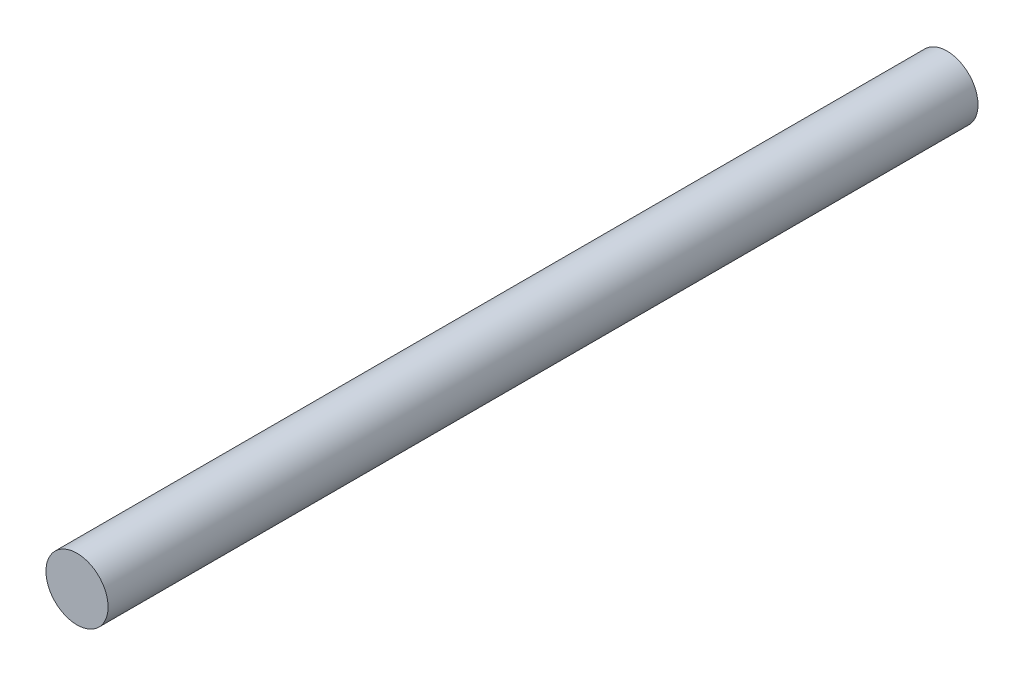
ISO-10303-21;
HEADER;
FILE_DESCRIPTION(('STEP AP214'),'2;1');
FILE_NAME('part.step','',(''),(''),'','','');
FILE_SCHEMA(('AUTOMOTIVE_DESIGN { 1 0 10303 214 1 1 1 1 }'));
ENDSEC;
DATA;
#1=APPLICATION_CONTEXT('core data for automotive mechanical design processes');
#2=APPLICATION_PROTOCOL_DEFINITION('international standard','automotive_design',2000,#1);
#3=PRODUCT_CONTEXT('',#1,'mechanical');
#4=PRODUCT('Part','Part','',(#3));
#5=PRODUCT_RELATED_PRODUCT_CATEGORY('part','',(#4));
#6=PRODUCT_DEFINITION_FORMATION('','',#4);
#7=PRODUCT_DEFINITION_CONTEXT('part definition',#1,'design');
#8=PRODUCT_DEFINITION('design','',#6,#7);
#9=PRODUCT_DEFINITION_SHAPE('','',#8);
#10=(LENGTH_UNIT() NAMED_UNIT(*) SI_UNIT(.MILLI.,.METRE.));
#11=(NAMED_UNIT(*) PLANE_ANGLE_UNIT() SI_UNIT($,.RADIAN.));
#12=(NAMED_UNIT(*) SI_UNIT($,.STERADIAN.) SOLID_ANGLE_UNIT());
#13=UNCERTAINTY_MEASURE_WITH_UNIT(LENGTH_MEASURE(1.E-05),#10,'distance_accuracy_value','');
#14=(GEOMETRIC_REPRESENTATION_CONTEXT(3) GLOBAL_UNCERTAINTY_ASSIGNED_CONTEXT((#13)) GLOBAL_UNIT_ASSIGNED_CONTEXT((#10,
#11,#12)) REPRESENTATION_CONTEXT('',''));
#15=CARTESIAN_POINT('',(0.,0.,0.));
#16=DIRECTION('',(0.,0.,1.));
#17=DIRECTION('',(1.,0.,0.));
#18=AXIS2_PLACEMENT_3D('',#15,#16,#17);
#19=CARTESIAN_POINT('',(0.,0.,70.));
#20=DIRECTION('',(0.,0.,-1.));
#21=DIRECTION('',(-1.,0.,0.));
#22=AXIS2_PLACEMENT_3D('',#19,#20,#21);
#23=CYLINDRICAL_SURFACE('',#22,5.);
#24=CARTESIAN_POINT('',(0.,0.,70.));
#25=DIRECTION('',(0.,0.,1.));
#26=DIRECTION('',(1.,0.,0.));
#27=AXIS2_PLACEMENT_3D('',#24,#25,#26);
#28=CIRCLE('',#27,5.);
#29=CARTESIAN_POINT('',(5.,0.,70.));
#30=VERTEX_POINT('',#29);
#31=EDGE_CURVE('E10',#30,#30,#28,.T.);
#32=ORIENTED_EDGE('',*,*,#31,.F.);
#33=EDGE_LOOP('',(#32));
#34=FACE_BOUND('',#33,.T.);
#35=CARTESIAN_POINT('',(0.,0.,-70.));
#36=DIRECTION('',(0.,0.,1.));
#37=DIRECTION('',(1.,0.,0.));
#38=AXIS2_PLACEMENT_3D('',#35,#36,#37);
#39=CIRCLE('',#38,5.);
#40=CARTESIAN_POINT('',(5.,0.,-70.));
#41=VERTEX_POINT('',#40);
#42=EDGE_CURVE('E36',#41,#41,#39,.T.);
#43=ORIENTED_EDGE('',*,*,#42,.T.);
#44=EDGE_LOOP('',(#43));
#45=FACE_BOUND('',#44,.T.);
#46=ADVANCED_FACE('F33',(#34,#45),#23,.T.);
#47=CARTESIAN_POINT('',(0.,0.,70.));
#48=DIRECTION('',(0.,0.,1.));
#49=DIRECTION('',(1.,0.,0.));
#50=AXIS2_PLACEMENT_3D('',#47,#48,#49);
#51=PLANE('',#50);
#52=ORIENTED_EDGE('',*,*,#31,.T.);
#53=EDGE_LOOP('',(#52));
#54=FACE_BOUND('',#53,.T.);
#55=ADVANCED_FACE('F48',(#54),#51,.T.);
#56=CARTESIAN_POINT('',(0.,0.,-70.));
#57=DIRECTION('',(0.,0.,1.));
#58=DIRECTION('',(1.,0.,0.));
#59=AXIS2_PLACEMENT_3D('',#56,#57,#58);
#60=PLANE('',#59);
#61=ORIENTED_EDGE('',*,*,#42,.F.);
#62=EDGE_LOOP('',(#61));
#63=FACE_BOUND('',#62,.T.);
#64=ADVANCED_FACE('F46',(#63),#60,.F.);
#65=CLOSED_SHELL('',(#46,#55,#64));
#66=MANIFOLD_SOLID_BREP('B2',#65);
#67=ADVANCED_BREP_SHAPE_REPRESENTATION('',(#18,#66),#14);
#68=SHAPE_DEFINITION_REPRESENTATION(#9,#67);
ENDSEC;
END-ISO-10303-21;
